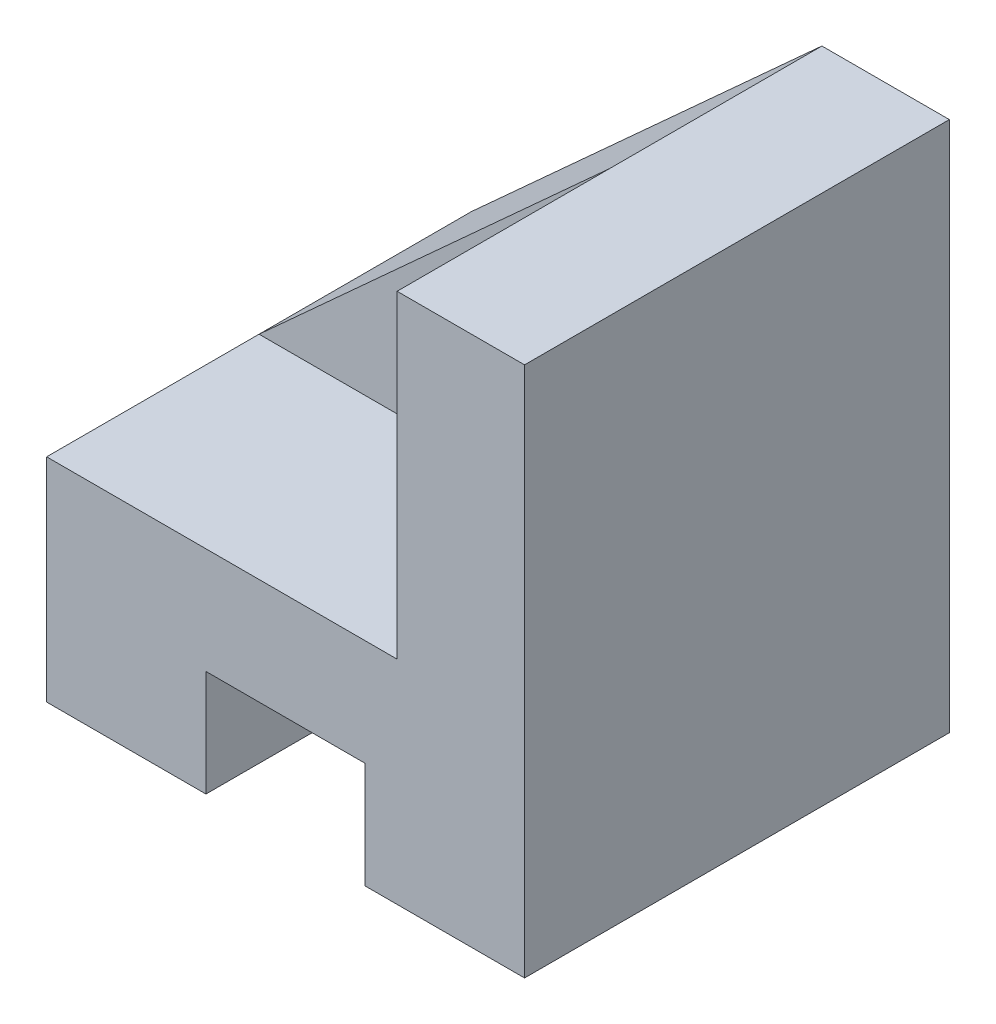
ISO-10303-21;
HEADER;
FILE_DESCRIPTION(('STEP AP214'),'2;1');
FILE_NAME('part.step','',(''),(''),'','','');
FILE_SCHEMA(('AUTOMOTIVE_DESIGN { 1 0 10303 214 1 1 1 1 }'));
ENDSEC;
DATA;
#1=APPLICATION_CONTEXT('core data for automotive mechanical design processes');
#2=APPLICATION_PROTOCOL_DEFINITION('international standard','automotive_design',2000,#1);
#3=PRODUCT_CONTEXT('',#1,'mechanical');
#4=PRODUCT('Part','Part','',(#3));
#5=PRODUCT_RELATED_PRODUCT_CATEGORY('part','',(#4));
#6=PRODUCT_DEFINITION_FORMATION('','',#4);
#7=PRODUCT_DEFINITION_CONTEXT('part definition',#1,'design');
#8=PRODUCT_DEFINITION('design','',#6,#7);
#9=PRODUCT_DEFINITION_SHAPE('','',#8);
#10=(LENGTH_UNIT() NAMED_UNIT(*) SI_UNIT(.MILLI.,.METRE.));
#11=(NAMED_UNIT(*) PLANE_ANGLE_UNIT() SI_UNIT($,.RADIAN.));
#12=(NAMED_UNIT(*) SI_UNIT($,.STERADIAN.) SOLID_ANGLE_UNIT());
#13=UNCERTAINTY_MEASURE_WITH_UNIT(LENGTH_MEASURE(1.E-05),#10,'distance_accuracy_value','');
#14=(GEOMETRIC_REPRESENTATION_CONTEXT(3) GLOBAL_UNCERTAINTY_ASSIGNED_CONTEXT((#13)) GLOBAL_UNIT_ASSIGNED_CONTEXT((#10,
#11,#12)) REPRESENTATION_CONTEXT('',''));
#15=CARTESIAN_POINT('',(0.,0.,0.));
#16=DIRECTION('',(0.,0.,1.));
#17=DIRECTION('',(1.,0.,0.));
#18=AXIS2_PLACEMENT_3D('',#15,#16,#17);
#19=CARTESIAN_POINT('',(0.,50.,0.));
#20=DIRECTION('',(0.,-1.,0.));
#21=DIRECTION('',(0.,0.,-1.));
#22=AXIS2_PLACEMENT_3D('',#19,#20,#21);
#23=PLANE('',#22);
#24=DIRECTION('',(0.,0.,-1.));
#25=VECTOR('',#24,1.);
#26=CARTESIAN_POINT('',(10.5,50.,122.827974015616));
#27=LINE('',#26,#25);
#28=CARTESIAN_POINT('',(10.5,50.,0.));
#29=VERTEX_POINT('',#28);
#30=CARTESIAN_POINT('',(10.5,50.,-20.));
#31=VERTEX_POINT('',#30);
#32=EDGE_CURVE('E143',#29,#31,#27,.T.);
#33=ORIENTED_EDGE('',*,*,#32,.F.);
#34=DIRECTION('',(0.,0.,-1.));
#35=VECTOR('',#34,1.);
#36=CARTESIAN_POINT('',(10.5,50.,20.));
#37=LINE('',#36,#35);
#38=CARTESIAN_POINT('',(10.5,50.,20.));
#39=VERTEX_POINT('',#38);
#40=EDGE_CURVE('E121',#39,#29,#37,.T.);
#41=ORIENTED_EDGE('',*,*,#40,.F.);
#42=DIRECTION('',(1.,0.,0.));
#43=VECTOR('',#42,1.);
#44=CARTESIAN_POINT('',(-22.5,50.,20.));
#45=LINE('',#44,#43);
#46=CARTESIAN_POINT('',(22.5,50.,20.));
#47=VERTEX_POINT('',#46);
#48=EDGE_CURVE('E191',#39,#47,#45,.T.);
#49=ORIENTED_EDGE('',*,*,#48,.T.);
#50=DIRECTION('',(0.,0.,-1.));
#51=VECTOR('',#50,1.);
#52=CARTESIAN_POINT('',(22.5,50.,20.));
#53=LINE('',#52,#51);
#54=CARTESIAN_POINT('',(22.5,50.,-20.));
#55=VERTEX_POINT('',#54);
#56=EDGE_CURVE('E187',#47,#55,#53,.T.);
#57=ORIENTED_EDGE('',*,*,#56,.T.);
#58=DIRECTION('',(-1.,0.,0.));
#59=VECTOR('',#58,1.);
#60=CARTESIAN_POINT('',(-22.5,50.,-20.));
#61=LINE('',#60,#59);
#62=EDGE_CURVE('E145',#55,#31,#61,.T.);
#63=ORIENTED_EDGE('',*,*,#62,.T.);
#64=EDGE_LOOP('',(#33,#41,#49,#57,#63));
#65=FACE_BOUND('',#64,.T.);
#66=ADVANCED_FACE('F37',(#65),#23,.F.);
#67=CARTESIAN_POINT('',(10.5,50.,0.));
#68=DIRECTION('',(0.,0.,-1.));
#69=DIRECTION('',(0.,1.,0.));
#70=AXIS2_PLACEMENT_3D('',#67,#68,#69);
#71=PLANE('',#70);
#72=DIRECTION('',(0.739940073395944,0.672672793996313,0.));
#73=VECTOR('',#72,1.);
#74=CARTESIAN_POINT('',(10.5,50.,0.));
#75=LINE('',#74,#73);
#76=CARTESIAN_POINT('',(-22.5,20.,0.));
#77=VERTEX_POINT('',#76);
#78=EDGE_CURVE('E136',#77,#29,#75,.T.);
#79=ORIENTED_EDGE('',*,*,#78,.F.);
#80=DIRECTION('',(-1.,0.,0.));
#81=VECTOR('',#80,1.);
#82=CARTESIAN_POINT('',(10.5,20.,0.));
#83=LINE('',#82,#81);
#84=CARTESIAN_POINT('',(10.5,20.,0.));
#85=VERTEX_POINT('',#84);
#86=EDGE_CURVE('E138',#85,#77,#83,.T.);
#87=ORIENTED_EDGE('',*,*,#86,.F.);
#88=DIRECTION('',(0.,-1.,0.));
#89=VECTOR('',#88,1.);
#90=CARTESIAN_POINT('',(10.5,50.,0.));
#91=LINE('',#90,#89);
#92=EDGE_CURVE('E125',#29,#85,#91,.T.);
#93=ORIENTED_EDGE('',*,*,#92,.F.);
#94=EDGE_LOOP('',(#79,#87,#93));
#95=FACE_BOUND('',#94,.T.);
#96=ADVANCED_FACE('F134',(#95),#71,.F.);
#97=CARTESIAN_POINT('',(0.,0.,0.));
#98=DIRECTION('',(0.,-1.,0.));
#99=DIRECTION('',(0.,0.,-1.));
#100=AXIS2_PLACEMENT_3D('',#97,#98,#99);
#101=PLANE('',#100);
#102=DIRECTION('',(0.,0.,1.));
#103=VECTOR('',#102,1.);
#104=CARTESIAN_POINT('',(-7.5,0.,-20.));
#105=LINE('',#104,#103);
#106=CARTESIAN_POINT('',(-7.5,0.,-20.));
#107=VERTEX_POINT('',#106);
#108=CARTESIAN_POINT('',(-7.5,0.,20.));
#109=VERTEX_POINT('',#108);
#110=EDGE_CURVE('E171',#107,#109,#105,.T.);
#111=ORIENTED_EDGE('',*,*,#110,.T.);
#112=DIRECTION('',(1.,0.,0.));
#113=VECTOR('',#112,1.);
#114=CARTESIAN_POINT('',(-22.5,0.,20.));
#115=LINE('',#114,#113);
#116=CARTESIAN_POINT('',(-22.5,0.,20.));
#117=VERTEX_POINT('',#116);
#118=EDGE_CURVE('E189',#117,#109,#115,.T.);
#119=ORIENTED_EDGE('',*,*,#118,.F.);
#120=DIRECTION('',(0.,0.,1.));
#121=VECTOR('',#120,1.);
#122=CARTESIAN_POINT('',(-22.5,0.,20.));
#123=LINE('',#122,#121);
#124=CARTESIAN_POINT('',(-22.5,0.,-20.));
#125=VERTEX_POINT('',#124);
#126=EDGE_CURVE('E200',#125,#117,#123,.T.);
#127=ORIENTED_EDGE('',*,*,#126,.F.);
#128=DIRECTION('',(-1.,0.,0.));
#129=VECTOR('',#128,1.);
#130=CARTESIAN_POINT('',(-22.5,0.,-20.));
#131=LINE('',#130,#129);
#132=EDGE_CURVE('E196',#107,#125,#131,.T.);
#133=ORIENTED_EDGE('',*,*,#132,.F.);
#134=EDGE_LOOP('',(#111,#119,#127,#133));
#135=FACE_BOUND('',#134,.T.);
#136=ADVANCED_FACE('F218',(#135),#101,.T.);
#137=CARTESIAN_POINT('',(22.5,50.,20.));
#138=DIRECTION('',(-1.,0.,0.));
#139=DIRECTION('',(0.,0.,1.));
#140=AXIS2_PLACEMENT_3D('',#137,#138,#139);
#141=PLANE('',#140);
#142=DIRECTION('',(0.,0.,-1.));
#143=VECTOR('',#142,1.);
#144=CARTESIAN_POINT('',(22.5,0.,20.));
#145=LINE('',#144,#143);
#146=CARTESIAN_POINT('',(22.5,0.,20.));
#147=VERTEX_POINT('',#146);
#148=CARTESIAN_POINT('',(22.5,0.,-20.));
#149=VERTEX_POINT('',#148);
#150=EDGE_CURVE('E180',#147,#149,#145,.T.);
#151=ORIENTED_EDGE('',*,*,#150,.T.);
#152=DIRECTION('',(0.,-1.,0.));
#153=VECTOR('',#152,1.);
#154=CARTESIAN_POINT('',(22.5,50.,-20.));
#155=LINE('',#154,#153);
#156=EDGE_CURVE('E11',#55,#149,#155,.T.);
#157=ORIENTED_EDGE('',*,*,#156,.F.);
#158=ORIENTED_EDGE('',*,*,#56,.F.);
#159=DIRECTION('',(0.,-1.,0.));
#160=VECTOR('',#159,1.);
#161=CARTESIAN_POINT('',(22.5,50.,20.));
#162=LINE('',#161,#160);
#163=EDGE_CURVE('E193',#47,#147,#162,.T.);
#164=ORIENTED_EDGE('',*,*,#163,.T.);
#165=EDGE_LOOP('',(#151,#157,#158,#164));
#166=FACE_BOUND('',#165,.T.);
#167=ADVANCED_FACE('F39',(#166),#141,.F.);
#168=CARTESIAN_POINT('',(-22.5,50.,-20.));
#169=DIRECTION('',(0.,0.,1.));
#170=DIRECTION('',(1.,0.,0.));
#171=AXIS2_PLACEMENT_3D('',#168,#169,#170);
#172=PLANE('',#171);
#173=DIRECTION('',(0.,-1.,0.));
#174=VECTOR('',#173,1.);
#175=CARTESIAN_POINT('',(-22.5,50.,-20.));
#176=LINE('',#175,#174);
#177=CARTESIAN_POINT('',(-22.5,20.,-20.));
#178=VERTEX_POINT('',#177);
#179=EDGE_CURVE('E45',#178,#125,#176,.T.);
#180=ORIENTED_EDGE('',*,*,#179,.F.);
#181=DIRECTION('',(0.739940073395944,0.672672793996313,0.));
#182=VECTOR('',#181,1.);
#183=CARTESIAN_POINT('',(10.5,50.,-20.));
#184=LINE('',#183,#182);
#185=EDGE_CURVE('E59',#178,#31,#184,.T.);
#186=ORIENTED_EDGE('',*,*,#185,.T.);
#187=ORIENTED_EDGE('',*,*,#62,.F.);
#188=ORIENTED_EDGE('',*,*,#156,.T.);
#189=CARTESIAN_POINT('',(7.49999999999999,0.,-20.));
#190=VERTEX_POINT('',#189);
#191=EDGE_CURVE('E197',#149,#190,#131,.T.);
#192=ORIENTED_EDGE('',*,*,#191,.T.);
#193=DIRECTION('',(0.,1.,0.));
#194=VECTOR('',#193,1.);
#195=CARTESIAN_POINT('',(7.5,10.,-20.));
#196=LINE('',#195,#194);
#197=CARTESIAN_POINT('',(7.5,10.,-20.));
#198=VERTEX_POINT('',#197);
#199=EDGE_CURVE('E164',#190,#198,#196,.T.);
#200=ORIENTED_EDGE('',*,*,#199,.T.);
#201=DIRECTION('',(-1.,0.,0.));
#202=VECTOR('',#201,1.);
#203=CARTESIAN_POINT('',(-7.5,10.,-20.));
#204=LINE('',#203,#202);
#205=CARTESIAN_POINT('',(-7.5,10.,-20.));
#206=VERTEX_POINT('',#205);
#207=EDGE_CURVE('E168',#198,#206,#204,.T.);
#208=ORIENTED_EDGE('',*,*,#207,.T.);
#209=DIRECTION('',(0.,-1.,0.));
#210=VECTOR('',#209,1.);
#211=CARTESIAN_POINT('',(-7.5,10.,-20.));
#212=LINE('',#211,#210);
#213=EDGE_CURVE('E161',#206,#107,#212,.T.);
#214=ORIENTED_EDGE('',*,*,#213,.T.);
#215=ORIENTED_EDGE('',*,*,#132,.T.);
#216=EDGE_LOOP('',(#180,#186,#187,#188,#192,#200,#208,#214,#215));
#217=FACE_BOUND('',#216,.T.);
#218=ADVANCED_FACE('F215',(#217),#172,.F.);
#219=CARTESIAN_POINT('',(-22.5,50.,20.));
#220=DIRECTION('',(1.,0.,0.));
#221=DIRECTION('',(0.,0.,-1.));
#222=AXIS2_PLACEMENT_3D('',#219,#220,#221);
#223=PLANE('',#222);
#224=DIRECTION('',(0.,0.,1.));
#225=VECTOR('',#224,1.);
#226=CARTESIAN_POINT('',(-22.5,20.,0.));
#227=LINE('',#226,#225);
#228=CARTESIAN_POINT('',(-22.5,20.,20.));
#229=VERTEX_POINT('',#228);
#230=EDGE_CURVE('E131',#77,#229,#227,.T.);
#231=ORIENTED_EDGE('',*,*,#230,.F.);
#232=DIRECTION('',(0.,0.,-1.));
#233=VECTOR('',#232,1.);
#234=CARTESIAN_POINT('',(-22.5,20.,122.827974015616));
#235=LINE('',#234,#233);
#236=EDGE_CURVE('E52',#77,#178,#235,.T.);
#237=ORIENTED_EDGE('',*,*,#236,.T.);
#238=ORIENTED_EDGE('',*,*,#179,.T.);
#239=ORIENTED_EDGE('',*,*,#126,.T.);
#240=DIRECTION('',(0.,-1.,0.));
#241=VECTOR('',#240,1.);
#242=CARTESIAN_POINT('',(-22.5,50.,20.));
#243=LINE('',#242,#241);
#244=EDGE_CURVE('E208',#229,#117,#243,.T.);
#245=ORIENTED_EDGE('',*,*,#244,.F.);
#246=EDGE_LOOP('',(#231,#237,#238,#239,#245));
#247=FACE_BOUND('',#246,.T.);
#248=ADVANCED_FACE('F210',(#247),#223,.F.);
#249=CARTESIAN_POINT('',(-22.5,50.,20.));
#250=DIRECTION('',(0.,0.,-1.));
#251=DIRECTION('',(-1.,0.,0.));
#252=AXIS2_PLACEMENT_3D('',#249,#250,#251);
#253=PLANE('',#252);
#254=DIRECTION('',(0.,1.,0.));
#255=VECTOR('',#254,1.);
#256=CARTESIAN_POINT('',(10.5,20.,20.));
#257=LINE('',#256,#255);
#258=CARTESIAN_POINT('',(10.5,20.,20.));
#259=VERTEX_POINT('',#258);
#260=EDGE_CURVE('E127',#259,#39,#257,.T.);
#261=ORIENTED_EDGE('',*,*,#260,.F.);
#262=DIRECTION('',(-1.,0.,0.));
#263=VECTOR('',#262,1.);
#264=CARTESIAN_POINT('',(10.5,20.,20.));
#265=LINE('',#264,#263);
#266=EDGE_CURVE('E156',#259,#229,#265,.T.);
#267=ORIENTED_EDGE('',*,*,#266,.T.);
#268=ORIENTED_EDGE('',*,*,#244,.T.);
#269=ORIENTED_EDGE('',*,*,#118,.T.);
#270=DIRECTION('',(0.,-1.,0.));
#271=VECTOR('',#270,1.);
#272=CARTESIAN_POINT('',(-7.5,10.,20.));
#273=LINE('',#272,#271);
#274=CARTESIAN_POINT('',(-7.5,10.,20.));
#275=VERTEX_POINT('',#274);
#276=EDGE_CURVE('E159',#275,#109,#273,.T.);
#277=ORIENTED_EDGE('',*,*,#276,.F.);
#278=DIRECTION('',(-1.,0.,0.));
#279=VECTOR('',#278,1.);
#280=CARTESIAN_POINT('',(-7.5,10.,20.));
#281=LINE('',#280,#279);
#282=CARTESIAN_POINT('',(7.5,10.,20.));
#283=VERTEX_POINT('',#282);
#284=EDGE_CURVE('E165',#283,#275,#281,.T.);
#285=ORIENTED_EDGE('',*,*,#284,.F.);
#286=DIRECTION('',(0.,1.,0.));
#287=VECTOR('',#286,1.);
#288=CARTESIAN_POINT('',(7.5,10.,20.));
#289=LINE('',#288,#287);
#290=CARTESIAN_POINT('',(7.5,0.,20.));
#291=VERTEX_POINT('',#290);
#292=EDGE_CURVE('E173',#291,#283,#289,.T.);
#293=ORIENTED_EDGE('',*,*,#292,.F.);
#294=EDGE_CURVE('E203',#291,#147,#115,.T.);
#295=ORIENTED_EDGE('',*,*,#294,.T.);
#296=ORIENTED_EDGE('',*,*,#163,.F.);
#297=ORIENTED_EDGE('',*,*,#48,.F.);
#298=EDGE_LOOP('',(#261,#267,#268,#269,#277,#285,#293,#295,#296,#297));
#299=FACE_BOUND('',#298,.T.);
#300=ADVANCED_FACE('F221',(#299),#253,.F.);
#301=DIRECTION('',(0.,0.,1.));
#302=VECTOR('',#301,1.);
#303=CARTESIAN_POINT('',(7.5,0.,-20.));
#304=LINE('',#303,#302);
#305=EDGE_CURVE('E183',#190,#291,#304,.T.);
#306=ORIENTED_EDGE('',*,*,#305,.F.);
#307=ORIENTED_EDGE('',*,*,#191,.F.);
#308=ORIENTED_EDGE('',*,*,#150,.F.);
#309=ORIENTED_EDGE('',*,*,#294,.F.);
#310=EDGE_LOOP('',(#306,#307,#308,#309));
#311=FACE_BOUND('',#310,.T.);
#312=ADVANCED_FACE('F232',(#311),#101,.T.);
#313=CARTESIAN_POINT('',(-7.5,10.,-20.));
#314=DIRECTION('',(-1.,0.,0.));
#315=DIRECTION('',(0.,-1.,0.));
#316=AXIS2_PLACEMENT_3D('',#313,#314,#315);
#317=PLANE('',#316);
#318=ORIENTED_EDGE('',*,*,#276,.T.);
#319=ORIENTED_EDGE('',*,*,#110,.F.);
#320=ORIENTED_EDGE('',*,*,#213,.F.);
#321=DIRECTION('',(0.,0.,1.));
#322=VECTOR('',#321,1.);
#323=CARTESIAN_POINT('',(-7.5,10.,-20.));
#324=LINE('',#323,#322);
#325=EDGE_CURVE('E178',#206,#275,#324,.T.);
#326=ORIENTED_EDGE('',*,*,#325,.T.);
#327=EDGE_LOOP('',(#318,#319,#320,#326));
#328=FACE_BOUND('',#327,.T.);
#329=ADVANCED_FACE('F241',(#328),#317,.F.);
#330=CARTESIAN_POINT('',(-7.5,10.,-20.));
#331=DIRECTION('',(0.,1.,0.));
#332=DIRECTION('',(0.,0.,1.));
#333=AXIS2_PLACEMENT_3D('',#330,#331,#332);
#334=PLANE('',#333);
#335=ORIENTED_EDGE('',*,*,#284,.T.);
#336=ORIENTED_EDGE('',*,*,#325,.F.);
#337=ORIENTED_EDGE('',*,*,#207,.F.);
#338=DIRECTION('',(0.,0.,1.));
#339=VECTOR('',#338,1.);
#340=CARTESIAN_POINT('',(7.5,10.,-20.));
#341=LINE('',#340,#339);
#342=EDGE_CURVE('E181',#198,#283,#341,.T.);
#343=ORIENTED_EDGE('',*,*,#342,.T.);
#344=EDGE_LOOP('',(#335,#336,#337,#343));
#345=FACE_BOUND('',#344,.T.);
#346=ADVANCED_FACE('F238',(#345),#334,.F.);
#347=CARTESIAN_POINT('',(7.5,10.,-20.));
#348=DIRECTION('',(1.,0.,0.));
#349=DIRECTION('',(0.,1.,0.));
#350=AXIS2_PLACEMENT_3D('',#347,#348,#349);
#351=PLANE('',#350);
#352=ORIENTED_EDGE('',*,*,#292,.T.);
#353=ORIENTED_EDGE('',*,*,#342,.F.);
#354=ORIENTED_EDGE('',*,*,#199,.F.);
#355=ORIENTED_EDGE('',*,*,#305,.T.);
#356=EDGE_LOOP('',(#352,#353,#354,#355));
#357=FACE_BOUND('',#356,.T.);
#358=ADVANCED_FACE('F236',(#357),#351,.F.);
#359=CARTESIAN_POINT('',(10.5,20.,0.));
#360=DIRECTION('',(0.,-1.,0.));
#361=DIRECTION('',(0.,0.,-1.));
#362=AXIS2_PLACEMENT_3D('',#359,#360,#361);
#363=PLANE('',#362);
#364=ORIENTED_EDGE('',*,*,#230,.T.);
#365=ORIENTED_EDGE('',*,*,#266,.F.);
#366=DIRECTION('',(0.,0.,1.));
#367=VECTOR('',#366,1.);
#368=CARTESIAN_POINT('',(10.5,20.,0.));
#369=LINE('',#368,#367);
#370=EDGE_CURVE('E140',#85,#259,#369,.T.);
#371=ORIENTED_EDGE('',*,*,#370,.F.);
#372=ORIENTED_EDGE('',*,*,#86,.T.);
#373=EDGE_LOOP('',(#364,#365,#371,#372));
#374=FACE_BOUND('',#373,.T.);
#375=ADVANCED_FACE('F224',(#374),#363,.F.);
#376=CARTESIAN_POINT('',(10.5,0.,0.));
#377=DIRECTION('',(-1.,0.,0.));
#378=DIRECTION('',(0.,0.,1.));
#379=AXIS2_PLACEMENT_3D('',#376,#377,#378);
#380=PLANE('',#379);
#381=ORIENTED_EDGE('',*,*,#40,.T.);
#382=ORIENTED_EDGE('',*,*,#92,.T.);
#383=ORIENTED_EDGE('',*,*,#370,.T.);
#384=ORIENTED_EDGE('',*,*,#260,.T.);
#385=EDGE_LOOP('',(#381,#382,#383,#384));
#386=FACE_BOUND('',#385,.T.);
#387=ADVANCED_FACE('F123',(#386),#380,.T.);
#388=CARTESIAN_POINT('',(10.5,50.,122.827974015616));
#389=DIRECTION('',(0.672672793996313,-0.739940073395943,0.));
#390=DIRECTION('',(0.739940073395944,0.672672793996313,0.));
#391=AXIS2_PLACEMENT_3D('',#388,#389,#390);
#392=PLANE('',#391);
#393=ORIENTED_EDGE('',*,*,#78,.T.);
#394=ORIENTED_EDGE('',*,*,#32,.T.);
#395=ORIENTED_EDGE('',*,*,#185,.F.);
#396=ORIENTED_EDGE('',*,*,#236,.F.);
#397=EDGE_LOOP('',(#393,#394,#395,#396));
#398=FACE_BOUND('',#397,.T.);
#399=ADVANCED_FACE('F148',(#398),#392,.F.);
#400=CLOSED_SHELL('',(#66,#96,#136,#167,#218,#248,#300,#312,#329,#346,#358,#375,#387,#399));
#401=MANIFOLD_SOLID_BREP('B2',#400);
#402=ADVANCED_BREP_SHAPE_REPRESENTATION('',(#18,#401),#14);
#403=SHAPE_DEFINITION_REPRESENTATION(#9,#402);
ENDSEC;
END-ISO-10303-21;
